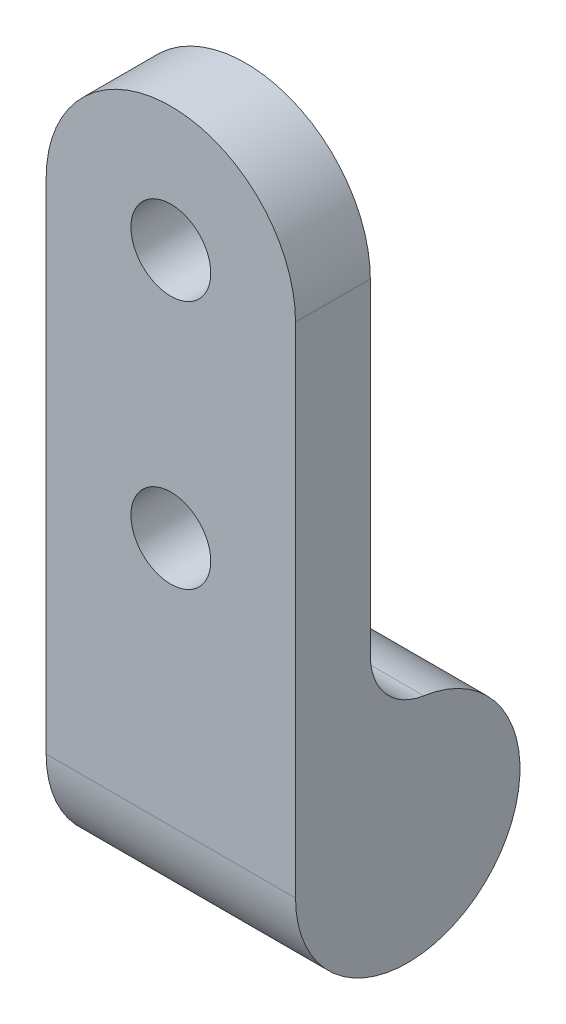
ISO-10303-21;
HEADER;
FILE_DESCRIPTION(('STEP AP214'),'2;1');
FILE_NAME('part.step','',(''),(''),'','','');
FILE_SCHEMA(('AUTOMOTIVE_DESIGN { 1 0 10303 214 1 1 1 1 }'));
ENDSEC;
DATA;
#1=APPLICATION_CONTEXT('core data for automotive mechanical design processes');
#2=APPLICATION_PROTOCOL_DEFINITION('international standard','automotive_design',2000,#1);
#3=PRODUCT_CONTEXT('',#1,'mechanical');
#4=PRODUCT('Part','Part','',(#3));
#5=PRODUCT_RELATED_PRODUCT_CATEGORY('part','',(#4));
#6=PRODUCT_DEFINITION_FORMATION('','',#4);
#7=PRODUCT_DEFINITION_CONTEXT('part definition',#1,'design');
#8=PRODUCT_DEFINITION('design','',#6,#7);
#9=PRODUCT_DEFINITION_SHAPE('','',#8);
#10=(LENGTH_UNIT() NAMED_UNIT(*) SI_UNIT(.MILLI.,.METRE.));
#11=(NAMED_UNIT(*) PLANE_ANGLE_UNIT() SI_UNIT($,.RADIAN.));
#12=(NAMED_UNIT(*) SI_UNIT($,.STERADIAN.) SOLID_ANGLE_UNIT());
#13=UNCERTAINTY_MEASURE_WITH_UNIT(LENGTH_MEASURE(1.E-05),#10,'distance_accuracy_value','');
#14=(GEOMETRIC_REPRESENTATION_CONTEXT(3) GLOBAL_UNCERTAINTY_ASSIGNED_CONTEXT((#13)) GLOBAL_UNIT_ASSIGNED_CONTEXT((#10,
#11,#12)) REPRESENTATION_CONTEXT('',''));
#15=CARTESIAN_POINT('',(0.,0.,0.));
#16=DIRECTION('',(0.,0.,1.));
#17=DIRECTION('',(1.,0.,0.));
#18=AXIS2_PLACEMENT_3D('',#15,#16,#17);
#19=CARTESIAN_POINT('',(0.,6.92820323027551,-0.999999999999999));
#20=DIRECTION('',(1.,0.,0.));
#21=DIRECTION('',(0.,0.,-1.));
#22=AXIS2_PLACEMENT_3D('',#19,#20,#21);
#23=PLANE('',#22);
#24=DIRECTION('',(0.,0.,-1.));
#25=VECTOR('',#24,1.);
#26=CARTESIAN_POINT('',(0.,20.,4.50000000000001));
#27=LINE('',#26,#25);
#28=CARTESIAN_POINT('',(0.,20.,4.50000000000001));
#29=VERTEX_POINT('',#28);
#30=CARTESIAN_POINT('',(0.,20.,1.5));
#31=VERTEX_POINT('',#30);
#32=EDGE_CURVE('E144',#29,#31,#27,.T.);
#33=ORIENTED_EDGE('',*,*,#32,.T.);
#34=DIRECTION('',(0.,1.,0.));
#35=VECTOR('',#34,1.);
#36=CARTESIAN_POINT('',(0.,25.,1.5));
#37=LINE('',#36,#35);
#38=CARTESIAN_POINT('',(0.,6.92820323027551,1.5));
#39=VERTEX_POINT('',#38);
#40=EDGE_CURVE('E151',#39,#31,#37,.T.);
#41=ORIENTED_EDGE('',*,*,#40,.F.);
#42=CARTESIAN_POINT('',(0.,6.92820323027551,-0.999999999999999));
#43=DIRECTION('',(-1.,0.,0.));
#44=DIRECTION('',(0.,0.,-1.));
#45=AXIS2_PLACEMENT_3D('',#42,#43,#44);
#46=CIRCLE('',#45,2.5);
#47=CARTESIAN_POINT('',(0.,4.45384493374854,-0.642857142857141));
#48=VERTEX_POINT('',#47);
#49=EDGE_CURVE('E155',#48,#39,#46,.T.);
#50=ORIENTED_EDGE('',*,*,#49,.F.);
#51=CARTESIAN_POINT('',(0.,0.,0.));
#52=DIRECTION('',(1.,0.,0.));
#53=DIRECTION('',(0.,0.,-1.));
#54=AXIS2_PLACEMENT_3D('',#51,#52,#53);
#55=CIRCLE('',#54,4.5);
#56=CARTESIAN_POINT('',(0.,0.,4.5));
#57=VERTEX_POINT('',#56);
#58=EDGE_CURVE('E120',#57,#48,#55,.T.);
#59=ORIENTED_EDGE('',*,*,#58,.F.);
#60=DIRECTION('',(0.,-1.,0.));
#61=VECTOR('',#60,1.);
#62=CARTESIAN_POINT('',(0.,25.,4.5));
#63=LINE('',#62,#61);
#64=EDGE_CURVE('E138',#29,#57,#63,.T.);
#65=ORIENTED_EDGE('',*,*,#64,.F.);
#66=EDGE_LOOP('',(#33,#41,#50,#59,#65));
#67=FACE_BOUND('',#66,.T.);
#68=ADVANCED_FACE('F79',(#67),#23,.F.);
#69=CARTESIAN_POINT('',(10.,25.,1.5));
#70=DIRECTION('',(0.,0.,1.));
#71=DIRECTION('',(0.,-1.,0.));
#72=AXIS2_PLACEMENT_3D('',#69,#70,#71);
#73=PLANE('',#72);
#74=CARTESIAN_POINT('',(5.,20.,1.5));
#75=DIRECTION('',(0.,0.,-1.));
#76=DIRECTION('',(0.,1.,0.));
#77=AXIS2_PLACEMENT_3D('',#74,#75,#76);
#78=CIRCLE('',#77,1.6);
#79=CARTESIAN_POINT('',(5.,21.6,1.5));
#80=VERTEX_POINT('',#79);
#81=EDGE_CURVE('E204',#80,#80,#78,.T.);
#82=ORIENTED_EDGE('',*,*,#81,.F.);
#83=EDGE_LOOP('',(#82));
#84=FACE_BOUND('',#83,.T.);
#85=CARTESIAN_POINT('',(5.,10.,1.5));
#86=DIRECTION('',(0.,0.,-1.));
#87=DIRECTION('',(0.,1.,0.));
#88=AXIS2_PLACEMENT_3D('',#85,#86,#87);
#89=CIRCLE('',#88,1.6);
#90=CARTESIAN_POINT('',(5.,11.6,1.5));
#91=VERTEX_POINT('',#90);
#92=EDGE_CURVE('E209',#91,#91,#89,.T.);
#93=ORIENTED_EDGE('',*,*,#92,.F.);
#94=EDGE_LOOP('',(#93));
#95=FACE_BOUND('',#94,.T.);
#96=ORIENTED_EDGE('',*,*,#40,.T.);
#97=CARTESIAN_POINT('',(5.,20.,1.5));
#98=DIRECTION('',(0.,0.,-1.));
#99=DIRECTION('',(0.,1.,0.));
#100=AXIS2_PLACEMENT_3D('',#97,#98,#99);
#101=CIRCLE('',#100,5.);
#102=CARTESIAN_POINT('',(10.,20.,1.5));
#103=VERTEX_POINT('',#102);
#104=EDGE_CURVE('E141',#103,#31,#101,.F.);
#105=ORIENTED_EDGE('',*,*,#104,.F.);
#106=DIRECTION('',(0.,1.,0.));
#107=VECTOR('',#106,1.);
#108=CARTESIAN_POINT('',(10.,25.,1.5));
#109=LINE('',#108,#107);
#110=CARTESIAN_POINT('',(10.,6.92820323027551,1.5));
#111=VERTEX_POINT('',#110);
#112=EDGE_CURVE('E126',#111,#103,#109,.T.);
#113=ORIENTED_EDGE('',*,*,#112,.F.);
#114=DIRECTION('',(-1.,0.,0.));
#115=VECTOR('',#114,1.);
#116=CARTESIAN_POINT('',(10.,6.92820323027551,1.5));
#117=LINE('',#116,#115);
#118=EDGE_CURVE('E12',#111,#39,#117,.T.);
#119=ORIENTED_EDGE('',*,*,#118,.T.);
#120=EDGE_LOOP('',(#96,#105,#113,#119));
#121=FACE_BOUND('',#120,.T.);
#122=ADVANCED_FACE('F172',(#84,#95,#121),#73,.F.);
#123=CARTESIAN_POINT('',(10.,25.,4.5));
#124=DIRECTION('',(0.,0.,-1.));
#125=DIRECTION('',(0.,1.,0.));
#126=AXIS2_PLACEMENT_3D('',#123,#124,#125);
#127=PLANE('',#126);
#128=CARTESIAN_POINT('',(5.,20.,4.50000000000001));
#129=DIRECTION('',(0.,0.,-1.));
#130=DIRECTION('',(0.,1.,0.));
#131=AXIS2_PLACEMENT_3D('',#128,#129,#130);
#132=CIRCLE('',#131,1.6);
#133=CARTESIAN_POINT('',(5.,21.6,4.50000000000001));
#134=VERTEX_POINT('',#133);
#135=EDGE_CURVE('E148',#134,#134,#132,.T.);
#136=ORIENTED_EDGE('',*,*,#135,.T.);
#137=EDGE_LOOP('',(#136));
#138=FACE_BOUND('',#137,.T.);
#139=CARTESIAN_POINT('',(5.,10.,4.5));
#140=DIRECTION('',(0.,0.,-1.));
#141=DIRECTION('',(0.,1.,0.));
#142=AXIS2_PLACEMENT_3D('',#139,#140,#141);
#143=CIRCLE('',#142,1.6);
#144=CARTESIAN_POINT('',(5.,11.6,4.50000000000001));
#145=VERTEX_POINT('',#144);
#146=EDGE_CURVE('E205',#145,#145,#143,.T.);
#147=ORIENTED_EDGE('',*,*,#146,.T.);
#148=EDGE_LOOP('',(#147));
#149=FACE_BOUND('',#148,.T.);
#150=CARTESIAN_POINT('',(5.,20.,4.50000000000001));
#151=DIRECTION('',(0.,0.,-1.));
#152=DIRECTION('',(0.,1.,0.));
#153=AXIS2_PLACEMENT_3D('',#150,#151,#152);
#154=CIRCLE('',#153,5.);
#155=CARTESIAN_POINT('',(10.,20.,4.5));
#156=VERTEX_POINT('',#155);
#157=EDGE_CURVE('E94',#156,#29,#154,.F.);
#158=ORIENTED_EDGE('',*,*,#157,.T.);
#159=ORIENTED_EDGE('',*,*,#64,.T.);
#160=DIRECTION('',(-1.,0.,0.));
#161=VECTOR('',#160,1.);
#162=CARTESIAN_POINT('',(10.,0.,4.5));
#163=LINE('',#162,#161);
#164=CARTESIAN_POINT('',(10.,0.,4.5));
#165=VERTEX_POINT('',#164);
#166=EDGE_CURVE('E87',#165,#57,#163,.T.);
#167=ORIENTED_EDGE('',*,*,#166,.F.);
#168=DIRECTION('',(0.,-1.,0.));
#169=VECTOR('',#168,1.);
#170=CARTESIAN_POINT('',(10.,25.,4.5));
#171=LINE('',#170,#169);
#172=EDGE_CURVE('E139',#156,#165,#171,.T.);
#173=ORIENTED_EDGE('',*,*,#172,.F.);
#174=EDGE_LOOP('',(#158,#159,#167,#173));
#175=FACE_BOUND('',#174,.T.);
#176=ADVANCED_FACE('F135',(#138,#149,#175),#127,.F.);
#177=CARTESIAN_POINT('',(10.,6.92820323027551,-0.999999999999999));
#178=DIRECTION('',(1.,0.,0.));
#179=DIRECTION('',(0.,0.,-1.));
#180=AXIS2_PLACEMENT_3D('',#177,#178,#179);
#181=PLANE('',#180);
#182=ORIENTED_EDGE('',*,*,#112,.T.);
#183=DIRECTION('',(0.,0.,-1.));
#184=VECTOR('',#183,1.);
#185=CARTESIAN_POINT('',(10.,20.,4.50000000000001));
#186=LINE('',#185,#184);
#187=EDGE_CURVE('E140',#156,#103,#186,.T.);
#188=ORIENTED_EDGE('',*,*,#187,.F.);
#189=ORIENTED_EDGE('',*,*,#172,.T.);
#190=CARTESIAN_POINT('',(10.,0.,0.));
#191=DIRECTION('',(1.,0.,0.));
#192=DIRECTION('',(0.,0.,-1.));
#193=AXIS2_PLACEMENT_3D('',#190,#191,#192);
#194=CIRCLE('',#193,4.5);
#195=CARTESIAN_POINT('',(10.,4.45384493374854,-0.642857142857141));
#196=VERTEX_POINT('',#195);
#197=EDGE_CURVE('E103',#165,#196,#194,.T.);
#198=ORIENTED_EDGE('',*,*,#197,.T.);
#199=CARTESIAN_POINT('',(10.,6.92820323027551,-0.999999999999999));
#200=DIRECTION('',(-1.,0.,0.));
#201=DIRECTION('',(0.,0.,-1.));
#202=AXIS2_PLACEMENT_3D('',#199,#200,#201);
#203=CIRCLE('',#202,2.5);
#204=EDGE_CURVE('E153',#196,#111,#203,.T.);
#205=ORIENTED_EDGE('',*,*,#204,.T.);
#206=EDGE_LOOP('',(#182,#188,#189,#198,#205));
#207=FACE_BOUND('',#206,.T.);
#208=ADVANCED_FACE('F171',(#207),#181,.T.);
#209=CARTESIAN_POINT('',(10.,6.92820323027551,-0.999999999999999));
#210=DIRECTION('',(-1.,0.,0.));
#211=DIRECTION('',(0.,0.,1.));
#212=AXIS2_PLACEMENT_3D('',#209,#210,#211);
#213=CYLINDRICAL_SURFACE('',#212,2.5);
#214=ORIENTED_EDGE('',*,*,#49,.T.);
#215=ORIENTED_EDGE('',*,*,#118,.F.);
#216=ORIENTED_EDGE('',*,*,#204,.F.);
#217=DIRECTION('',(-1.,0.,0.));
#218=VECTOR('',#217,1.);
#219=CARTESIAN_POINT('',(10.,4.45384493374854,-0.642857142857141));
#220=LINE('',#219,#218);
#221=EDGE_CURVE('E159',#196,#48,#220,.T.);
#222=ORIENTED_EDGE('',*,*,#221,.T.);
#223=EDGE_LOOP('',(#214,#215,#216,#222));
#224=FACE_BOUND('',#223,.T.);
#225=ADVANCED_FACE('F81',(#224),#213,.F.);
#226=CARTESIAN_POINT('',(10.,0.,0.));
#227=DIRECTION('',(-1.,0.,0.));
#228=DIRECTION('',(0.,0.,1.));
#229=AXIS2_PLACEMENT_3D('',#226,#227,#228);
#230=CYLINDRICAL_SURFACE('',#229,4.5);
#231=ORIENTED_EDGE('',*,*,#58,.T.);
#232=ORIENTED_EDGE('',*,*,#221,.F.);
#233=ORIENTED_EDGE('',*,*,#197,.F.);
#234=ORIENTED_EDGE('',*,*,#166,.T.);
#235=EDGE_LOOP('',(#231,#232,#233,#234));
#236=FACE_BOUND('',#235,.T.);
#237=ADVANCED_FACE('F160',(#236),#230,.T.);
#238=CARTESIAN_POINT('',(5.,20.,4.50000000000001));
#239=DIRECTION('',(0.,0.,-1.));
#240=DIRECTION('',(0.,1.,0.));
#241=AXIS2_PLACEMENT_3D('',#238,#239,#240);
#242=CYLINDRICAL_SURFACE('',#241,5.);
#243=ORIENTED_EDGE('',*,*,#104,.T.);
#244=ORIENTED_EDGE('',*,*,#32,.F.);
#245=ORIENTED_EDGE('',*,*,#157,.F.);
#246=ORIENTED_EDGE('',*,*,#187,.T.);
#247=EDGE_LOOP('',(#243,#244,#245,#246));
#248=FACE_BOUND('',#247,.T.);
#249=ADVANCED_FACE('F145',(#248),#242,.T.);
#250=CARTESIAN_POINT('',(5.,10.,4.5));
#251=DIRECTION('',(0.,0.,-1.));
#252=DIRECTION('',(0.,1.,0.));
#253=AXIS2_PLACEMENT_3D('',#250,#251,#252);
#254=CYLINDRICAL_SURFACE('',#253,1.6);
#255=CARTESIAN_POINT('',(5.,11.6,4.50000000000001));
#256=CARTESIAN_POINT('',(5.,11.6,4.46875000000001));
#257=CARTESIAN_POINT('',(5.,11.6,4.4375));
#258=CARTESIAN_POINT('',(5.,11.6,4.375));
#259=CARTESIAN_POINT('',(5.,11.6,4.34375));
#260=CARTESIAN_POINT('',(5.,11.6,4.28125));
#261=CARTESIAN_POINT('',(5.,11.6,4.25));
#262=CARTESIAN_POINT('',(5.,11.6,4.1875));
#263=CARTESIAN_POINT('',(5.,11.6,4.15625));
#264=CARTESIAN_POINT('',(5.,11.6,4.09375));
#265=CARTESIAN_POINT('',(5.,11.6,4.0625));
#266=CARTESIAN_POINT('',(5.,11.6,4.));
#267=CARTESIAN_POINT('',(5.,11.6,3.96875));
#268=CARTESIAN_POINT('',(5.,11.6,3.90625));
#269=CARTESIAN_POINT('',(5.,11.6,3.875));
#270=CARTESIAN_POINT('',(5.,11.6,3.8125));
#271=CARTESIAN_POINT('',(5.,11.6,3.78125));
#272=CARTESIAN_POINT('',(5.,11.6,3.71875));
#273=CARTESIAN_POINT('',(5.,11.6,3.6875));
#274=CARTESIAN_POINT('',(5.,11.6,3.625));
#275=CARTESIAN_POINT('',(5.,11.6,3.59375));
#276=CARTESIAN_POINT('',(5.,11.6,3.53125));
#277=CARTESIAN_POINT('',(5.,11.6,3.5));
#278=CARTESIAN_POINT('',(5.,11.6,3.4375));
#279=CARTESIAN_POINT('',(5.,11.6,3.40625));
#280=CARTESIAN_POINT('',(5.,11.6,3.34375));
#281=CARTESIAN_POINT('',(5.,11.6,3.3125));
#282=CARTESIAN_POINT('',(5.,11.6,3.25));
#283=CARTESIAN_POINT('',(5.,11.6,3.21875));
#284=CARTESIAN_POINT('',(5.,11.6,3.15625));
#285=CARTESIAN_POINT('',(5.,11.6,3.125));
#286=CARTESIAN_POINT('',(5.,11.6,3.0625));
#287=CARTESIAN_POINT('',(5.,11.6,3.03125));
#288=CARTESIAN_POINT('',(5.,11.6,2.96875));
#289=CARTESIAN_POINT('',(5.,11.6,2.9375));
#290=CARTESIAN_POINT('',(5.,11.6,2.875));
#291=CARTESIAN_POINT('',(5.,11.6,2.84375));
#292=CARTESIAN_POINT('',(5.,11.6,2.78125));
#293=CARTESIAN_POINT('',(5.,11.6,2.75));
#294=CARTESIAN_POINT('',(5.,11.6,2.6875));
#295=CARTESIAN_POINT('',(5.,11.6,2.65625));
#296=CARTESIAN_POINT('',(5.,11.6,2.59375));
#297=CARTESIAN_POINT('',(5.,11.6,2.5625));
#298=CARTESIAN_POINT('',(5.,11.6,2.5));
#299=CARTESIAN_POINT('',(5.,11.6,2.46875));
#300=CARTESIAN_POINT('',(5.,11.6,2.40625));
#301=CARTESIAN_POINT('',(5.,11.6,2.375));
#302=CARTESIAN_POINT('',(5.,11.6,2.3125));
#303=CARTESIAN_POINT('',(5.,11.6,2.28125));
#304=CARTESIAN_POINT('',(5.,11.6,2.21875));
#305=CARTESIAN_POINT('',(5.,11.6,2.1875));
#306=CARTESIAN_POINT('',(5.,11.6,2.125));
#307=CARTESIAN_POINT('',(5.,11.6,2.09375));
#308=CARTESIAN_POINT('',(5.,11.6,2.03125));
#309=CARTESIAN_POINT('',(5.,11.6,2.));
#310=CARTESIAN_POINT('',(5.,11.6,1.9375));
#311=CARTESIAN_POINT('',(5.,11.6,1.90625));
#312=CARTESIAN_POINT('',(5.,11.6,1.84375));
#313=CARTESIAN_POINT('',(5.,11.6,1.8125));
#314=CARTESIAN_POINT('',(5.,11.6,1.75));
#315=CARTESIAN_POINT('',(5.,11.6,1.71875));
#316=CARTESIAN_POINT('',(5.,11.6,1.65625));
#317=CARTESIAN_POINT('',(5.,11.6,1.625));
#318=CARTESIAN_POINT('',(5.,11.6,1.5625));
#319=CARTESIAN_POINT('',(5.,11.6,1.53125));
#320=CARTESIAN_POINT('',(5.,11.6,1.5));
#321=B_SPLINE_CURVE_WITH_KNOTS('',3,(#255,#256,#257,#258,#259,#260,#261,#262,#263,#264,#265,
#266,#267,#268,#269,#270,#271,#272,#273,#274,#275,#276,#277,#278,#279,#280,#281,#282,#283,#284,
#285,#286,#287,#288,#289,#290,#291,#292,#293,#294,#295,#296,#297,#298,#299,#300,#301,#302,#303,
#304,#305,#306,#307,#308,#309,#310,#311,#312,#313,#314,#315,#316,#317,#318,#319,#320),
.UNSPECIFIED.,.F.,.F.,(4,2,2,2,2,2,2,2,2,2,2,2,2,2,2,2,2,2,2,2,2,2,2,2,2,2,2,2,2,2,2,2,4),(0.,
0.0937500000000009,0.187500000000001,0.281250000000001,0.375000000000001,0.468750000000001,
0.562500000000001,0.656250000000001,0.750000000000002,0.843750000000002,0.937500000000002,
1.03125,1.125,1.21875,1.3125,1.40625,1.5,1.59375,1.6875,1.78125,1.875,1.96875,2.0625,2.15625,
2.25,2.34375,2.4375,2.53125,2.625,2.71875,2.8125,2.90625,3.),.UNSPECIFIED.);
#322=EDGE_CURVE('BSEAM191',#145,#91,#321,.T.);
#323=ORIENTED_EDGE('',*,*,#146,.F.);
#324=ORIENTED_EDGE('',*,*,#92,.T.);
#325=ORIENTED_EDGE('',*,*,#322,.T.);
#326=ORIENTED_EDGE('',*,*,#322,.F.);
#327=EDGE_LOOP('',(#323,#325,#324,#326));
#328=FACE_BOUND('',#327,.T.);
#329=ADVANCED_FACE('F191',(#328),#254,.F.);
#330=CARTESIAN_POINT('',(5.,20.,4.50000000000001));
#331=DIRECTION('',(0.,0.,-1.));
#332=DIRECTION('',(0.,1.,0.));
#333=AXIS2_PLACEMENT_3D('',#330,#331,#332);
#334=CYLINDRICAL_SURFACE('',#333,1.6);
#335=CARTESIAN_POINT('',(5.,21.6,4.50000000000001));
#336=CARTESIAN_POINT('',(5.,21.6,4.46875000000001));
#337=CARTESIAN_POINT('',(5.,21.6,4.43750000000001));
#338=CARTESIAN_POINT('',(5.,21.6,4.37500000000001));
#339=CARTESIAN_POINT('',(5.,21.6,4.34375000000001));
#340=CARTESIAN_POINT('',(5.,21.6,4.28125000000001));
#341=CARTESIAN_POINT('',(5.,21.6,4.25000000000001));
#342=CARTESIAN_POINT('',(5.,21.6,4.18750000000001));
#343=CARTESIAN_POINT('',(5.,21.6,4.15625000000001));
#344=CARTESIAN_POINT('',(5.,21.6,4.09375000000001));
#345=CARTESIAN_POINT('',(5.,21.6,4.06250000000001));
#346=CARTESIAN_POINT('',(5.,21.6,4.00000000000001));
#347=CARTESIAN_POINT('',(5.,21.6,3.96875000000001));
#348=CARTESIAN_POINT('',(5.,21.6,3.90625000000001));
#349=CARTESIAN_POINT('',(5.,21.6,3.87500000000001));
#350=CARTESIAN_POINT('',(5.,21.6,3.81250000000001));
#351=CARTESIAN_POINT('',(5.,21.6,3.78125));
#352=CARTESIAN_POINT('',(5.,21.6,3.71875));
#353=CARTESIAN_POINT('',(5.,21.6,3.6875));
#354=CARTESIAN_POINT('',(5.,21.6,3.625));
#355=CARTESIAN_POINT('',(5.,21.6,3.59375));
#356=CARTESIAN_POINT('',(5.,21.6,3.53125));
#357=CARTESIAN_POINT('',(5.,21.6,3.5));
#358=CARTESIAN_POINT('',(5.,21.6,3.4375));
#359=CARTESIAN_POINT('',(5.,21.6,3.40625));
#360=CARTESIAN_POINT('',(5.,21.6,3.34375));
#361=CARTESIAN_POINT('',(5.,21.6,3.3125));
#362=CARTESIAN_POINT('',(5.,21.6,3.25));
#363=CARTESIAN_POINT('',(5.,21.6,3.21875));
#364=CARTESIAN_POINT('',(5.,21.6,3.15625));
#365=CARTESIAN_POINT('',(5.,21.6,3.125));
#366=CARTESIAN_POINT('',(5.,21.6,3.0625));
#367=CARTESIAN_POINT('',(5.,21.6,3.03125));
#368=CARTESIAN_POINT('',(5.,21.6,2.96875));
#369=CARTESIAN_POINT('',(5.,21.6,2.9375));
#370=CARTESIAN_POINT('',(5.,21.6,2.875));
#371=CARTESIAN_POINT('',(5.,21.6,2.84375));
#372=CARTESIAN_POINT('',(5.,21.6,2.78125));
#373=CARTESIAN_POINT('',(5.,21.6,2.75));
#374=CARTESIAN_POINT('',(5.,21.6,2.6875));
#375=CARTESIAN_POINT('',(5.,21.6,2.65625));
#376=CARTESIAN_POINT('',(5.,21.6,2.59375));
#377=CARTESIAN_POINT('',(5.,21.6,2.5625));
#378=CARTESIAN_POINT('',(5.,21.6,2.5));
#379=CARTESIAN_POINT('',(5.,21.6,2.46875));
#380=CARTESIAN_POINT('',(5.,21.6,2.40625));
#381=CARTESIAN_POINT('',(5.,21.6,2.375));
#382=CARTESIAN_POINT('',(5.,21.6,2.3125));
#383=CARTESIAN_POINT('',(5.,21.6,2.28125));
#384=CARTESIAN_POINT('',(5.,21.6,2.21875));
#385=CARTESIAN_POINT('',(5.,21.6,2.1875));
#386=CARTESIAN_POINT('',(5.,21.6,2.125));
#387=CARTESIAN_POINT('',(5.,21.6,2.09375));
#388=CARTESIAN_POINT('',(5.,21.6,2.03125));
#389=CARTESIAN_POINT('',(5.,21.6,2.));
#390=CARTESIAN_POINT('',(5.,21.6,1.9375));
#391=CARTESIAN_POINT('',(5.,21.6,1.90625));
#392=CARTESIAN_POINT('',(5.,21.6,1.84375));
#393=CARTESIAN_POINT('',(5.,21.6,1.8125));
#394=CARTESIAN_POINT('',(5.,21.6,1.75));
#395=CARTESIAN_POINT('',(5.,21.6,1.71875));
#396=CARTESIAN_POINT('',(5.,21.6,1.65625));
#397=CARTESIAN_POINT('',(5.,21.6,1.625));
#398=CARTESIAN_POINT('',(5.,21.6,1.5625));
#399=CARTESIAN_POINT('',(5.,21.6,1.53125));
#400=CARTESIAN_POINT('',(5.,21.6,1.5));
#401=B_SPLINE_CURVE_WITH_KNOTS('',3,(#335,#336,#337,#338,#339,#340,#341,#342,#343,#344,#345,
#346,#347,#348,#349,#350,#351,#352,#353,#354,#355,#356,#357,#358,#359,#360,#361,#362,#363,#364,
#365,#366,#367,#368,#369,#370,#371,#372,#373,#374,#375,#376,#377,#378,#379,#380,#381,#382,#383,
#384,#385,#386,#387,#388,#389,#390,#391,#392,#393,#394,#395,#396,#397,#398,#399,#400),
.UNSPECIFIED.,.F.,.F.,(4,2,2,2,2,2,2,2,2,2,2,2,2,2,2,2,2,2,2,2,2,2,2,2,2,2,2,2,2,2,2,2,4),(0.,
0.0937500000000009,0.187500000000001,0.281250000000001,0.375000000000001,0.468750000000001,
0.562500000000001,0.656250000000001,0.750000000000002,0.843750000000002,0.937500000000002,
1.03125,1.125,1.21875,1.3125,1.40625,1.5,1.59375,1.6875,1.78125,1.875,1.96875,2.0625,2.15625,
2.25,2.34375,2.4375,2.53125,2.625,2.71875,2.8125,2.90625,3.),.UNSPECIFIED.);
#402=EDGE_CURVE('BSEAM194',#134,#80,#401,.T.);
#403=ORIENTED_EDGE('',*,*,#135,.F.);
#404=ORIENTED_EDGE('',*,*,#81,.T.);
#405=ORIENTED_EDGE('',*,*,#402,.T.);
#406=ORIENTED_EDGE('',*,*,#402,.F.);
#407=EDGE_LOOP('',(#403,#405,#404,#406));
#408=FACE_BOUND('',#407,.T.);
#409=ADVANCED_FACE('F194',(#408),#334,.F.);
#410=CLOSED_SHELL('',(#68,#122,#176,#208,#225,#237,#249,#329,#409));
#411=MANIFOLD_SOLID_BREP('B2',#410);
#412=ADVANCED_BREP_SHAPE_REPRESENTATION('',(#18,#411),#14);
#413=SHAPE_DEFINITION_REPRESENTATION(#9,#412);
ENDSEC;
END-ISO-10303-21;
